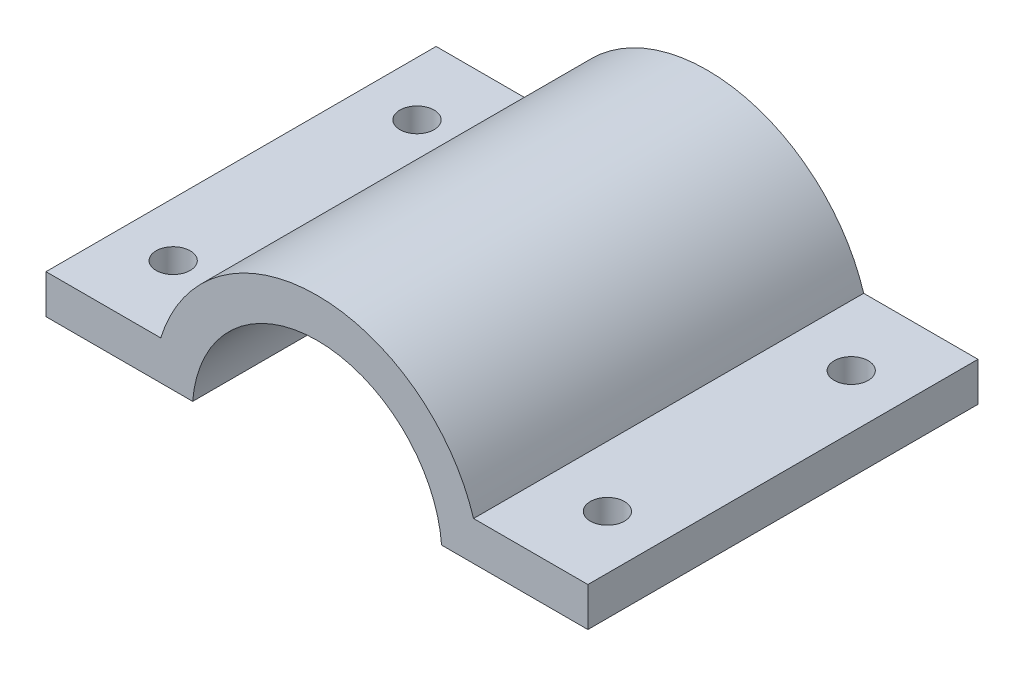
ISO-10303-21;
HEADER;
FILE_DESCRIPTION(('STEP AP214'),'2;1');
FILE_NAME('part.step','',(''),(''),'','','');
FILE_SCHEMA(('AUTOMOTIVE_DESIGN { 1 0 10303 214 1 1 1 1 }'));
ENDSEC;
DATA;
#1=APPLICATION_CONTEXT('core data for automotive mechanical design processes');
#2=APPLICATION_PROTOCOL_DEFINITION('international standard','automotive_design',2000,#1);
#3=PRODUCT_CONTEXT('',#1,'mechanical');
#4=PRODUCT('Part','Part','',(#3));
#5=PRODUCT_RELATED_PRODUCT_CATEGORY('part','',(#4));
#6=PRODUCT_DEFINITION_FORMATION('','',#4);
#7=PRODUCT_DEFINITION_CONTEXT('part definition',#1,'design');
#8=PRODUCT_DEFINITION('design','',#6,#7);
#9=PRODUCT_DEFINITION_SHAPE('','',#8);
#10=(LENGTH_UNIT() NAMED_UNIT(*) SI_UNIT(.MILLI.,.METRE.));
#11=(NAMED_UNIT(*) PLANE_ANGLE_UNIT() SI_UNIT($,.RADIAN.));
#12=(NAMED_UNIT(*) SI_UNIT($,.STERADIAN.) SOLID_ANGLE_UNIT());
#13=UNCERTAINTY_MEASURE_WITH_UNIT(LENGTH_MEASURE(1.E-05),#10,'distance_accuracy_value','');
#14=(GEOMETRIC_REPRESENTATION_CONTEXT(3) GLOBAL_UNCERTAINTY_ASSIGNED_CONTEXT((#13)) GLOBAL_UNIT_ASSIGNED_CONTEXT((#10,
#11,#12)) REPRESENTATION_CONTEXT('',''));
#15=CARTESIAN_POINT('',(0.,0.,0.));
#16=DIRECTION('',(0.,0.,1.));
#17=DIRECTION('',(1.,0.,0.));
#18=AXIS2_PLACEMENT_3D('',#15,#16,#17);
#19=CARTESIAN_POINT('',(0.,0.,40.));
#20=DIRECTION('',(0.,0.,-1.));
#21=DIRECTION('',(-1.,0.,0.));
#22=AXIS2_PLACEMENT_3D('',#19,#20,#21);
#23=CYLINDRICAL_SURFACE('',#22,12.8);
#24=CARTESIAN_POINT('',(0.,0.,0.));
#25=DIRECTION('',(0.,0.,-1.));
#26=DIRECTION('',(1.,0.,0.));
#27=AXIS2_PLACEMENT_3D('',#24,#25,#26);
#28=CIRCLE('',#27,12.8);
#29=CARTESIAN_POINT('',(-12.7608777127594,0.999999999999998,0.));
#30=VERTEX_POINT('',#29);
#31=CARTESIAN_POINT('',(12.7608777127594,0.999999999999998,0.));
#32=VERTEX_POINT('',#31);
#33=EDGE_CURVE('E145',#30,#32,#28,.T.);
#34=ORIENTED_EDGE('',*,*,#33,.T.);
#35=DIRECTION('',(0.,0.,-1.));
#36=VECTOR('',#35,1.);
#37=CARTESIAN_POINT('',(12.7608777127594,0.999999999999998,40.));
#38=LINE('',#37,#36);
#39=CARTESIAN_POINT('',(12.7608777127594,0.999999999999998,40.));
#40=VERTEX_POINT('',#39);
#41=EDGE_CURVE('E11',#40,#32,#38,.T.);
#42=ORIENTED_EDGE('',*,*,#41,.F.);
#43=CARTESIAN_POINT('',(0.,0.,40.));
#44=DIRECTION('',(0.,0.,-1.));
#45=DIRECTION('',(1.,0.,0.));
#46=AXIS2_PLACEMENT_3D('',#43,#44,#45);
#47=CIRCLE('',#46,12.8);
#48=CARTESIAN_POINT('',(-12.7608777127594,0.999999999999998,40.));
#49=VERTEX_POINT('',#48);
#50=EDGE_CURVE('E168',#49,#40,#47,.T.);
#51=ORIENTED_EDGE('',*,*,#50,.F.);
#52=DIRECTION('',(0.,0.,-1.));
#53=VECTOR('',#52,1.);
#54=CARTESIAN_POINT('',(-12.7608777127594,0.999999999999998,40.));
#55=LINE('',#54,#53);
#56=EDGE_CURVE('E141',#49,#30,#55,.T.);
#57=ORIENTED_EDGE('',*,*,#56,.T.);
#58=EDGE_LOOP('',(#34,#42,#51,#57));
#59=FACE_BOUND('',#58,.T.);
#60=ADVANCED_FACE('F44',(#59),#23,.F.);
#61=CARTESIAN_POINT('',(27.7608777127594,0.999999999999998,40.));
#62=DIRECTION('',(0.,1.,0.));
#63=DIRECTION('',(0.,0.,1.));
#64=AXIS2_PLACEMENT_3D('',#61,#62,#63);
#65=PLANE('',#64);
#66=CARTESIAN_POINT('',(22.2608777127594,0.999999999999998,7.5));
#67=DIRECTION('',(0.,1.,0.));
#68=DIRECTION('',(0.,0.,1.));
#69=AXIS2_PLACEMENT_3D('',#66,#67,#68);
#70=CIRCLE('',#69,1.75);
#71=CARTESIAN_POINT('',(22.2608777127594,0.999999999999998,9.25));
#72=VERTEX_POINT('',#71);
#73=EDGE_CURVE('E233',#72,#72,#70,.F.);
#74=ORIENTED_EDGE('',*,*,#73,.F.);
#75=EDGE_LOOP('',(#74));
#76=FACE_BOUND('',#75,.T.);
#77=CARTESIAN_POINT('',(22.2608777127594,0.999999999999998,32.5));
#78=DIRECTION('',(0.,1.,0.));
#79=DIRECTION('',(0.,0.,1.));
#80=AXIS2_PLACEMENT_3D('',#77,#78,#79);
#81=CIRCLE('',#80,1.75);
#82=CARTESIAN_POINT('',(22.2608777127594,0.999999999999998,34.25));
#83=VERTEX_POINT('',#82);
#84=EDGE_CURVE('E150',#83,#83,#81,.F.);
#85=ORIENTED_EDGE('',*,*,#84,.F.);
#86=EDGE_LOOP('',(#85));
#87=FACE_BOUND('',#86,.T.);
#88=DIRECTION('',(1.,0.,0.));
#89=VECTOR('',#88,1.);
#90=CARTESIAN_POINT('',(27.7608777127594,0.999999999999998,0.));
#91=LINE('',#90,#89);
#92=CARTESIAN_POINT('',(27.7608777127594,0.999999999999998,0.));
#93=VERTEX_POINT('',#92);
#94=EDGE_CURVE('E149',#32,#93,#91,.T.);
#95=ORIENTED_EDGE('',*,*,#94,.T.);
#96=DIRECTION('',(0.,0.,-1.));
#97=VECTOR('',#96,1.);
#98=CARTESIAN_POINT('',(27.7608777127594,0.999999999999998,40.));
#99=LINE('',#98,#97);
#100=CARTESIAN_POINT('',(27.7608777127594,0.999999999999998,40.));
#101=VERTEX_POINT('',#100);
#102=EDGE_CURVE('E53',#101,#93,#99,.T.);
#103=ORIENTED_EDGE('',*,*,#102,.F.);
#104=DIRECTION('',(1.,0.,0.));
#105=VECTOR('',#104,1.);
#106=CARTESIAN_POINT('',(27.7608777127594,0.999999999999998,40.));
#107=LINE('',#106,#105);
#108=EDGE_CURVE('E104',#40,#101,#107,.T.);
#109=ORIENTED_EDGE('',*,*,#108,.F.);
#110=ORIENTED_EDGE('',*,*,#41,.T.);
#111=EDGE_LOOP('',(#95,#103,#109,#110));
#112=FACE_BOUND('',#111,.T.);
#113=ADVANCED_FACE('F246',(#76,#87,#112),#65,.F.);
#114=CARTESIAN_POINT('',(27.7608777127594,5.00000000000001,40.));
#115=DIRECTION('',(-1.,0.,0.));
#116=DIRECTION('',(0.,0.,1.));
#117=AXIS2_PLACEMENT_3D('',#114,#115,#116);
#118=PLANE('',#117);
#119=DIRECTION('',(0.,1.,0.));
#120=VECTOR('',#119,1.);
#121=CARTESIAN_POINT('',(27.7608777127594,5.00000000000001,0.));
#122=LINE('',#121,#120);
#123=CARTESIAN_POINT('',(27.7608777127594,5.00000000000001,0.));
#124=VERTEX_POINT('',#123);
#125=EDGE_CURVE('E153',#93,#124,#122,.T.);
#126=ORIENTED_EDGE('',*,*,#125,.T.);
#127=DIRECTION('',(0.,0.,-1.));
#128=VECTOR('',#127,1.);
#129=CARTESIAN_POINT('',(27.7608777127594,5.00000000000001,40.));
#130=LINE('',#129,#128);
#131=CARTESIAN_POINT('',(27.7608777127594,5.00000000000001,40.));
#132=VERTEX_POINT('',#131);
#133=EDGE_CURVE('E179',#132,#124,#130,.T.);
#134=ORIENTED_EDGE('',*,*,#133,.F.);
#135=DIRECTION('',(0.,1.,0.));
#136=VECTOR('',#135,1.);
#137=CARTESIAN_POINT('',(27.7608777127594,5.00000000000001,40.));
#138=LINE('',#137,#136);
#139=EDGE_CURVE('E189',#101,#132,#138,.T.);
#140=ORIENTED_EDGE('',*,*,#139,.F.);
#141=ORIENTED_EDGE('',*,*,#102,.T.);
#142=EDGE_LOOP('',(#126,#134,#140,#141));
#143=FACE_BOUND('',#142,.T.);
#144=ADVANCED_FACE('F187',(#143),#118,.F.);
#145=CARTESIAN_POINT('',(16.0387031894726,5.,40.));
#146=DIRECTION('',(0.,-1.,0.));
#147=DIRECTION('',(1.,0.,0.));
#148=AXIS2_PLACEMENT_3D('',#145,#146,#147);
#149=PLANE('',#148);
#150=CARTESIAN_POINT('',(22.2608777127594,5.00000000000001,7.5));
#151=DIRECTION('',(0.,1.,0.));
#152=DIRECTION('',(-1.,0.,0.));
#153=AXIS2_PLACEMENT_3D('',#150,#151,#152);
#154=CIRCLE('',#153,1.75);
#155=CARTESIAN_POINT('',(20.5108777127594,5.00000000000001,7.5));
#156=VERTEX_POINT('',#155);
#157=EDGE_CURVE('E219',#156,#156,#154,.T.);
#158=ORIENTED_EDGE('',*,*,#157,.F.);
#159=EDGE_LOOP('',(#158));
#160=FACE_BOUND('',#159,.T.);
#161=CARTESIAN_POINT('',(22.2608777127594,5.00000000000001,32.5));
#162=DIRECTION('',(0.,1.,0.));
#163=DIRECTION('',(-1.,0.,0.));
#164=AXIS2_PLACEMENT_3D('',#161,#162,#163);
#165=CIRCLE('',#164,1.75);
#166=CARTESIAN_POINT('',(20.5108777127594,5.00000000000001,32.5));
#167=VERTEX_POINT('',#166);
#168=EDGE_CURVE('E215',#167,#167,#165,.T.);
#169=ORIENTED_EDGE('',*,*,#168,.F.);
#170=EDGE_LOOP('',(#169));
#171=FACE_BOUND('',#170,.T.);
#172=DIRECTION('',(-1.,0.,0.));
#173=VECTOR('',#172,1.);
#174=CARTESIAN_POINT('',(16.0387031894726,5.,0.));
#175=LINE('',#174,#173);
#176=CARTESIAN_POINT('',(16.0387031894726,5.,0.));
#177=VERTEX_POINT('',#176);
#178=EDGE_CURVE('E156',#124,#177,#175,.T.);
#179=ORIENTED_EDGE('',*,*,#178,.T.);
#180=DIRECTION('',(0.,0.,-1.));
#181=VECTOR('',#180,1.);
#182=CARTESIAN_POINT('',(16.0387031894726,5.,40.));
#183=LINE('',#182,#181);
#184=CARTESIAN_POINT('',(16.0387031894726,5.,40.));
#185=VERTEX_POINT('',#184);
#186=EDGE_CURVE('E175',#185,#177,#183,.T.);
#187=ORIENTED_EDGE('',*,*,#186,.F.);
#188=DIRECTION('',(-1.,0.,0.));
#189=VECTOR('',#188,1.);
#190=CARTESIAN_POINT('',(16.0387031894726,5.,40.));
#191=LINE('',#190,#189);
#192=EDGE_CURVE('E202',#132,#185,#191,.T.);
#193=ORIENTED_EDGE('',*,*,#192,.F.);
#194=ORIENTED_EDGE('',*,*,#133,.T.);
#195=EDGE_LOOP('',(#179,#187,#193,#194));
#196=FACE_BOUND('',#195,.T.);
#197=ADVANCED_FACE('F197',(#160,#171,#196),#149,.F.);
#198=CARTESIAN_POINT('',(0.,0.,40.));
#199=DIRECTION('',(0.,0.,-1.));
#200=DIRECTION('',(-1.,0.,0.));
#201=AXIS2_PLACEMENT_3D('',#198,#199,#200);
#202=CYLINDRICAL_SURFACE('',#201,16.8);
#203=CARTESIAN_POINT('',(0.,0.,0.));
#204=DIRECTION('',(0.,0.,1.));
#205=DIRECTION('',(-1.,0.,0.));
#206=AXIS2_PLACEMENT_3D('',#203,#204,#205);
#207=CIRCLE('',#206,16.8);
#208=CARTESIAN_POINT('',(-16.0387031894726,5.,0.));
#209=VERTEX_POINT('',#208);
#210=EDGE_CURVE('E159',#177,#209,#207,.T.);
#211=ORIENTED_EDGE('',*,*,#210,.T.);
#212=DIRECTION('',(0.,0.,-1.));
#213=VECTOR('',#212,1.);
#214=CARTESIAN_POINT('',(-16.0387031894726,5.,40.));
#215=LINE('',#214,#213);
#216=CARTESIAN_POINT('',(-16.0387031894726,5.,40.));
#217=VERTEX_POINT('',#216);
#218=EDGE_CURVE('E134',#217,#209,#215,.T.);
#219=ORIENTED_EDGE('',*,*,#218,.F.);
#220=CARTESIAN_POINT('',(0.,0.,40.));
#221=DIRECTION('',(0.,0.,1.));
#222=DIRECTION('',(-1.,0.,0.));
#223=AXIS2_PLACEMENT_3D('',#220,#221,#222);
#224=CIRCLE('',#223,16.8);
#225=EDGE_CURVE('E123',#185,#217,#224,.T.);
#226=ORIENTED_EDGE('',*,*,#225,.F.);
#227=ORIENTED_EDGE('',*,*,#186,.T.);
#228=EDGE_LOOP('',(#211,#219,#226,#227));
#229=FACE_BOUND('',#228,.T.);
#230=ADVANCED_FACE('F200',(#229),#202,.T.);
#231=CARTESIAN_POINT('',(-27.8,5.,40.));
#232=DIRECTION('',(0.,-1.,0.));
#233=DIRECTION('',(1.,0.,0.));
#234=AXIS2_PLACEMENT_3D('',#231,#232,#233);
#235=PLANE('',#234);
#236=CARTESIAN_POINT('',(-22.2608777127594,5.00000000000001,32.5));
#237=DIRECTION('',(0.,1.,0.));
#238=DIRECTION('',(1.,0.,0.));
#239=AXIS2_PLACEMENT_3D('',#236,#237,#238);
#240=CIRCLE('',#239,1.75);
#241=CARTESIAN_POINT('',(-20.5108777127594,5.00000000000001,32.5));
#242=VERTEX_POINT('',#241);
#243=EDGE_CURVE('E220',#242,#242,#240,.T.);
#244=ORIENTED_EDGE('',*,*,#243,.F.);
#245=EDGE_LOOP('',(#244));
#246=FACE_BOUND('',#245,.T.);
#247=CARTESIAN_POINT('',(-22.2608777127594,5.00000000000001,7.50000000000001));
#248=DIRECTION('',(0.,1.,0.));
#249=DIRECTION('',(1.,0.,0.));
#250=AXIS2_PLACEMENT_3D('',#247,#248,#249);
#251=CIRCLE('',#250,1.75);
#252=CARTESIAN_POINT('',(-20.5108777127594,5.00000000000001,7.50000000000001));
#253=VERTEX_POINT('',#252);
#254=EDGE_CURVE('E229',#253,#253,#251,.T.);
#255=ORIENTED_EDGE('',*,*,#254,.F.);
#256=EDGE_LOOP('',(#255));
#257=FACE_BOUND('',#256,.T.);
#258=DIRECTION('',(-1.,0.,0.));
#259=VECTOR('',#258,1.);
#260=CARTESIAN_POINT('',(-27.8,5.,0.));
#261=LINE('',#260,#259);
#262=CARTESIAN_POINT('',(-27.8,5.,0.));
#263=VERTEX_POINT('',#262);
#264=EDGE_CURVE('E132',#209,#263,#261,.T.);
#265=ORIENTED_EDGE('',*,*,#264,.T.);
#266=DIRECTION('',(0.,0.,-1.));
#267=VECTOR('',#266,1.);
#268=CARTESIAN_POINT('',(-27.8,5.,40.));
#269=LINE('',#268,#267);
#270=CARTESIAN_POINT('',(-27.8,5.,40.));
#271=VERTEX_POINT('',#270);
#272=EDGE_CURVE('E129',#271,#263,#269,.T.);
#273=ORIENTED_EDGE('',*,*,#272,.F.);
#274=DIRECTION('',(-1.,0.,0.));
#275=VECTOR('',#274,1.);
#276=CARTESIAN_POINT('',(-27.8,5.,40.));
#277=LINE('',#276,#275);
#278=EDGE_CURVE('E117',#217,#271,#277,.T.);
#279=ORIENTED_EDGE('',*,*,#278,.F.);
#280=ORIENTED_EDGE('',*,*,#218,.T.);
#281=EDGE_LOOP('',(#265,#273,#279,#280));
#282=FACE_BOUND('',#281,.T.);
#283=ADVANCED_FACE('F130',(#246,#257,#282),#235,.F.);
#284=CARTESIAN_POINT('',(-27.8,0.999999999999998,40.));
#285=DIRECTION('',(1.,0.,0.));
#286=DIRECTION('',(0.,0.,-1.));
#287=AXIS2_PLACEMENT_3D('',#284,#285,#286);
#288=PLANE('',#287);
#289=DIRECTION('',(0.,-1.,0.));
#290=VECTOR('',#289,1.);
#291=CARTESIAN_POINT('',(-27.8,0.999999999999998,0.));
#292=LINE('',#291,#290);
#293=CARTESIAN_POINT('',(-27.8,0.999999999999998,0.));
#294=VERTEX_POINT('',#293);
#295=EDGE_CURVE('E90',#263,#294,#292,.T.);
#296=ORIENTED_EDGE('',*,*,#295,.T.);
#297=DIRECTION('',(0.,0.,-1.));
#298=VECTOR('',#297,1.);
#299=CARTESIAN_POINT('',(-27.8,0.999999999999998,40.));
#300=LINE('',#299,#298);
#301=CARTESIAN_POINT('',(-27.8,0.999999999999998,40.));
#302=VERTEX_POINT('',#301);
#303=EDGE_CURVE('E135',#302,#294,#300,.T.);
#304=ORIENTED_EDGE('',*,*,#303,.F.);
#305=DIRECTION('',(0.,-1.,0.));
#306=VECTOR('',#305,1.);
#307=CARTESIAN_POINT('',(-27.8,0.999999999999998,40.));
#308=LINE('',#307,#306);
#309=EDGE_CURVE('E121',#271,#302,#308,.T.);
#310=ORIENTED_EDGE('',*,*,#309,.F.);
#311=ORIENTED_EDGE('',*,*,#272,.T.);
#312=EDGE_LOOP('',(#296,#304,#310,#311));
#313=FACE_BOUND('',#312,.T.);
#314=ADVANCED_FACE('F137',(#313),#288,.F.);
#315=CARTESIAN_POINT('',(-12.7608777127594,0.999999999999998,40.));
#316=DIRECTION('',(0.,1.,0.));
#317=DIRECTION('',(0.,0.,1.));
#318=AXIS2_PLACEMENT_3D('',#315,#316,#317);
#319=PLANE('',#318);
#320=CARTESIAN_POINT('',(-22.2608777127594,0.999999999999998,32.5));
#321=DIRECTION('',(0.,1.,0.));
#322=DIRECTION('',(0.,0.,1.));
#323=AXIS2_PLACEMENT_3D('',#320,#321,#322);
#324=CIRCLE('',#323,1.75);
#325=CARTESIAN_POINT('',(-22.2608777127594,0.999999999999998,34.25));
#326=VERTEX_POINT('',#325);
#327=EDGE_CURVE('E225',#326,#326,#324,.F.);
#328=ORIENTED_EDGE('',*,*,#327,.F.);
#329=EDGE_LOOP('',(#328));
#330=FACE_BOUND('',#329,.T.);
#331=CARTESIAN_POINT('',(-22.2608777127594,0.999999999999998,7.50000000000001));
#332=DIRECTION('',(0.,1.,0.));
#333=DIRECTION('',(0.,0.,1.));
#334=AXIS2_PLACEMENT_3D('',#331,#332,#333);
#335=CIRCLE('',#334,1.75);
#336=CARTESIAN_POINT('',(-22.2608777127594,0.999999999999998,9.25000000000001));
#337=VERTEX_POINT('',#336);
#338=EDGE_CURVE('E224',#337,#337,#335,.F.);
#339=ORIENTED_EDGE('',*,*,#338,.F.);
#340=EDGE_LOOP('',(#339));
#341=FACE_BOUND('',#340,.T.);
#342=DIRECTION('',(1.,0.,0.));
#343=VECTOR('',#342,1.);
#344=CARTESIAN_POINT('',(-12.7608777127594,0.999999999999998,0.));
#345=LINE('',#344,#343);
#346=EDGE_CURVE('E96',#294,#30,#345,.T.);
#347=ORIENTED_EDGE('',*,*,#346,.T.);
#348=ORIENTED_EDGE('',*,*,#56,.F.);
#349=DIRECTION('',(1.,0.,0.));
#350=VECTOR('',#349,1.);
#351=CARTESIAN_POINT('',(-12.7608777127594,0.999999999999998,40.));
#352=LINE('',#351,#350);
#353=EDGE_CURVE('E61',#302,#49,#352,.T.);
#354=ORIENTED_EDGE('',*,*,#353,.F.);
#355=ORIENTED_EDGE('',*,*,#303,.T.);
#356=EDGE_LOOP('',(#347,#348,#354,#355));
#357=FACE_BOUND('',#356,.T.);
#358=ADVANCED_FACE('F253',(#330,#341,#357),#319,.F.);
#359=CARTESIAN_POINT('',(0.,0.,40.));
#360=DIRECTION('',(0.,0.,1.));
#361=DIRECTION('',(1.,0.,0.));
#362=AXIS2_PLACEMENT_3D('',#359,#360,#361);
#363=PLANE('',#362);
#364=ORIENTED_EDGE('',*,*,#50,.T.);
#365=ORIENTED_EDGE('',*,*,#108,.T.);
#366=ORIENTED_EDGE('',*,*,#139,.T.);
#367=ORIENTED_EDGE('',*,*,#192,.T.);
#368=ORIENTED_EDGE('',*,*,#225,.T.);
#369=ORIENTED_EDGE('',*,*,#278,.T.);
#370=ORIENTED_EDGE('',*,*,#309,.T.);
#371=ORIENTED_EDGE('',*,*,#353,.T.);
#372=EDGE_LOOP('',(#364,#365,#366,#367,#368,#369,#370,#371));
#373=FACE_BOUND('',#372,.T.);
#374=ADVANCED_FACE('F119',(#373),#363,.T.);
#375=CARTESIAN_POINT('',(0.,0.,0.));
#376=DIRECTION('',(0.,0.,1.));
#377=DIRECTION('',(1.,0.,0.));
#378=AXIS2_PLACEMENT_3D('',#375,#376,#377);
#379=PLANE('',#378);
#380=ORIENTED_EDGE('',*,*,#33,.F.);
#381=ORIENTED_EDGE('',*,*,#346,.F.);
#382=ORIENTED_EDGE('',*,*,#295,.F.);
#383=ORIENTED_EDGE('',*,*,#264,.F.);
#384=ORIENTED_EDGE('',*,*,#210,.F.);
#385=ORIENTED_EDGE('',*,*,#178,.F.);
#386=ORIENTED_EDGE('',*,*,#125,.F.);
#387=ORIENTED_EDGE('',*,*,#94,.F.);
#388=EDGE_LOOP('',(#380,#381,#382,#383,#384,#385,#386,#387));
#389=FACE_BOUND('',#388,.T.);
#390=ADVANCED_FACE('F193',(#389),#379,.F.);
#391=CARTESIAN_POINT('',(-22.2608777127594,0.998999999999994,7.50000000000001));
#392=DIRECTION('',(0.,1.,0.));
#393=DIRECTION('',(-1.,0.,0.));
#394=AXIS2_PLACEMENT_3D('',#391,#392,#393);
#395=CYLINDRICAL_SURFACE('',#394,1.75);
#396=ORIENTED_EDGE('',*,*,#254,.T.);
#397=EDGE_LOOP('',(#396));
#398=FACE_BOUND('',#397,.T.);
#399=ORIENTED_EDGE('',*,*,#338,.T.);
#400=EDGE_LOOP('',(#399));
#401=FACE_BOUND('',#400,.T.);
#402=ADVANCED_FACE('F304',(#398,#401),#395,.F.);
#403=CARTESIAN_POINT('',(-22.2608777127594,0.998999999999994,32.5));
#404=DIRECTION('',(0.,1.,0.));
#405=DIRECTION('',(-1.,0.,0.));
#406=AXIS2_PLACEMENT_3D('',#403,#404,#405);
#407=CYLINDRICAL_SURFACE('',#406,1.75);
#408=ORIENTED_EDGE('',*,*,#243,.T.);
#409=EDGE_LOOP('',(#408));
#410=FACE_BOUND('',#409,.T.);
#411=ORIENTED_EDGE('',*,*,#327,.T.);
#412=EDGE_LOOP('',(#411));
#413=FACE_BOUND('',#412,.T.);
#414=ADVANCED_FACE('F338',(#410,#413),#407,.F.);
#415=CARTESIAN_POINT('',(22.2608777127594,0.998999999999997,32.5));
#416=DIRECTION('',(0.,1.,0.));
#417=DIRECTION('',(-1.,0.,0.));
#418=AXIS2_PLACEMENT_3D('',#415,#416,#417);
#419=CYLINDRICAL_SURFACE('',#418,1.75);
#420=ORIENTED_EDGE('',*,*,#168,.T.);
#421=EDGE_LOOP('',(#420));
#422=FACE_BOUND('',#421,.T.);
#423=ORIENTED_EDGE('',*,*,#84,.T.);
#424=EDGE_LOOP('',(#423));
#425=FACE_BOUND('',#424,.T.);
#426=ADVANCED_FACE('F347',(#422,#425),#419,.F.);
#427=CARTESIAN_POINT('',(22.2608777127594,0.998999999999997,7.5));
#428=DIRECTION('',(0.,1.,0.));
#429=DIRECTION('',(-1.,0.,0.));
#430=AXIS2_PLACEMENT_3D('',#427,#428,#429);
#431=CYLINDRICAL_SURFACE('',#430,1.75);
#432=ORIENTED_EDGE('',*,*,#157,.T.);
#433=EDGE_LOOP('',(#432));
#434=FACE_BOUND('',#433,.T.);
#435=ORIENTED_EDGE('',*,*,#73,.T.);
#436=EDGE_LOOP('',(#435));
#437=FACE_BOUND('',#436,.T.);
#438=ADVANCED_FACE('F244',(#434,#437),#431,.F.);
#439=CLOSED_SHELL('',(#60,#113,#144,#197,#230,#283,#314,#358,#374,#390,#402,#414,#426,#438));
#440=MANIFOLD_SOLID_BREP('B2',#439);
#441=ADVANCED_BREP_SHAPE_REPRESENTATION('',(#18,#440),#14);
#442=SHAPE_DEFINITION_REPRESENTATION(#9,#441);
ENDSEC;
END-ISO-10303-21;
